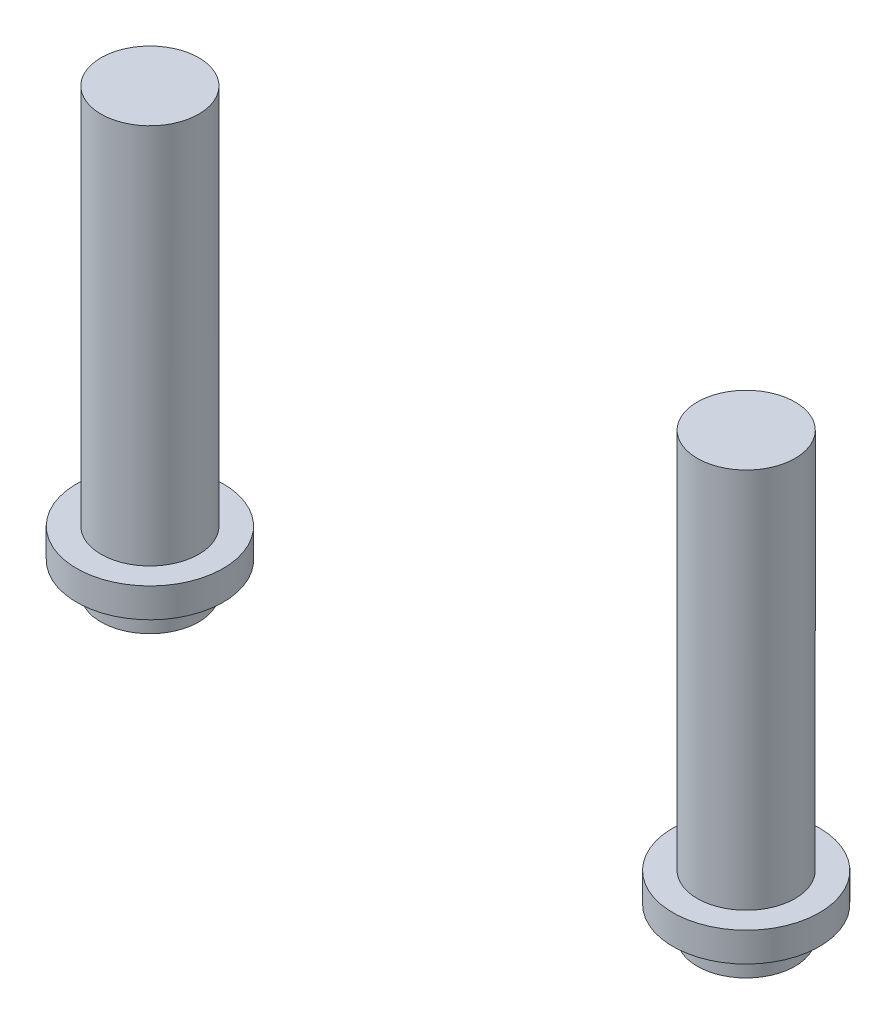
ISO-10303-21;
HEADER;
FILE_DESCRIPTION(('STEP AP214'),'2;1');
FILE_NAME('part.step','',(''),(''),'','','');
FILE_SCHEMA(('AUTOMOTIVE_DESIGN { 1 0 10303 214 1 1 1 1 }'));
ENDSEC;
DATA;
#1=APPLICATION_CONTEXT('core data for automotive mechanical design processes');
#2=APPLICATION_PROTOCOL_DEFINITION('international standard','automotive_design',2000,#1);
#3=PRODUCT_CONTEXT('',#1,'mechanical');
#4=PRODUCT('Part','Part','',(#3));
#5=PRODUCT_RELATED_PRODUCT_CATEGORY('part','',(#4));
#6=PRODUCT_DEFINITION_FORMATION('','',#4);
#7=PRODUCT_DEFINITION_CONTEXT('part definition',#1,'design');
#8=PRODUCT_DEFINITION('design','',#6,#7);
#9=PRODUCT_DEFINITION_SHAPE('','',#8);
#10=(LENGTH_UNIT() NAMED_UNIT(*) SI_UNIT(.MILLI.,.METRE.));
#11=(NAMED_UNIT(*) PLANE_ANGLE_UNIT() SI_UNIT($,.RADIAN.));
#12=(NAMED_UNIT(*) SI_UNIT($,.STERADIAN.) SOLID_ANGLE_UNIT());
#13=UNCERTAINTY_MEASURE_WITH_UNIT(LENGTH_MEASURE(1.E-05),#10,'distance_accuracy_value','');
#14=(GEOMETRIC_REPRESENTATION_CONTEXT(3) GLOBAL_UNCERTAINTY_ASSIGNED_CONTEXT((#13)) GLOBAL_UNIT_ASSIGNED_CONTEXT((#10,
#11,#12)) REPRESENTATION_CONTEXT('',''));
#15=CARTESIAN_POINT('',(0.,0.,0.));
#16=DIRECTION('',(0.,0.,1.));
#17=DIRECTION('',(1.,0.,0.));
#18=AXIS2_PLACEMENT_3D('',#15,#16,#17);
#19=CARTESIAN_POINT('',(19.5,0.,10.));
#20=DIRECTION('',(0.,1.,0.));
#21=DIRECTION('',(0.,0.,1.));
#22=AXIS2_PLACEMENT_3D('',#19,#20,#21);
#23=CYLINDRICAL_SURFACE('',#22,5.);
#24=CARTESIAN_POINT('',(19.5,6.,10.));
#25=DIRECTION('',(0.,-1.,0.));
#26=DIRECTION('',(0.,0.,-1.));
#27=AXIS2_PLACEMENT_3D('',#24,#25,#26);
#28=CIRCLE('',#27,5.);
#29=CARTESIAN_POINT('',(19.5,6.,5.));
#30=VERTEX_POINT('',#29);
#31=EDGE_CURVE('E65',#30,#30,#28,.T.);
#32=ORIENTED_EDGE('',*,*,#31,.F.);
#33=EDGE_LOOP('',(#32));
#34=FACE_BOUND('',#33,.T.);
#35=CARTESIAN_POINT('',(19.5,45.,9.99999999999999));
#36=DIRECTION('',(0.,1.,0.));
#37=DIRECTION('',(0.,0.,1.));
#38=AXIS2_PLACEMENT_3D('',#35,#36,#37);
#39=CIRCLE('',#38,5.);
#40=CARTESIAN_POINT('',(19.5,45.,15.));
#41=VERTEX_POINT('',#40);
#42=EDGE_CURVE('E69',#41,#41,#39,.T.);
#43=ORIENTED_EDGE('',*,*,#42,.F.);
#44=EDGE_LOOP('',(#43));
#45=FACE_BOUND('',#44,.T.);
#46=ADVANCED_FACE('F50',(#34,#45),#23,.T.);
#47=CARTESIAN_POINT('',(19.5,6.,10.));
#48=DIRECTION('',(0.,-1.,0.));
#49=DIRECTION('',(0.,0.,-1.));
#50=AXIS2_PLACEMENT_3D('',#47,#48,#49);
#51=CYLINDRICAL_SURFACE('',#50,7.5);
#52=CARTESIAN_POINT('',(19.5,6.,10.));
#53=DIRECTION('',(0.,-1.,0.));
#54=DIRECTION('',(0.,0.,-1.));
#55=AXIS2_PLACEMENT_3D('',#52,#53,#54);
#56=CIRCLE('',#55,7.5);
#57=CARTESIAN_POINT('',(19.5,6.,2.5));
#58=VERTEX_POINT('',#57);
#59=EDGE_CURVE('E67',#58,#58,#56,.T.);
#60=ORIENTED_EDGE('',*,*,#59,.T.);
#61=EDGE_LOOP('',(#60));
#62=FACE_BOUND('',#61,.T.);
#63=CARTESIAN_POINT('',(19.5,3.,10.));
#64=DIRECTION('',(0.,-1.,0.));
#65=DIRECTION('',(0.,0.,-1.));
#66=AXIS2_PLACEMENT_3D('',#63,#64,#65);
#67=CIRCLE('',#66,7.5);
#68=CARTESIAN_POINT('',(19.5,3.,2.5));
#69=VERTEX_POINT('',#68);
#70=EDGE_CURVE('E54',#69,#69,#67,.T.);
#71=ORIENTED_EDGE('',*,*,#70,.F.);
#72=EDGE_LOOP('',(#71));
#73=FACE_BOUND('',#72,.T.);
#74=ADVANCED_FACE('F52',(#62,#73),#51,.T.);
#75=CARTESIAN_POINT('',(19.5,6.,10.));
#76=DIRECTION('',(0.,-1.,0.));
#77=DIRECTION('',(0.,0.,-1.));
#78=AXIS2_PLACEMENT_3D('',#75,#76,#77);
#79=PLANE('',#78);
#80=ORIENTED_EDGE('',*,*,#31,.T.);
#81=EDGE_LOOP('',(#80));
#82=FACE_BOUND('',#81,.T.);
#83=ORIENTED_EDGE('',*,*,#59,.F.);
#84=EDGE_LOOP('',(#83));
#85=FACE_BOUND('',#84,.T.);
#86=ADVANCED_FACE('F85',(#82,#85),#79,.F.);
#87=CARTESIAN_POINT('',(19.5,3.,10.));
#88=DIRECTION('',(0.,-1.,0.));
#89=DIRECTION('',(0.,0.,-1.));
#90=AXIS2_PLACEMENT_3D('',#87,#88,#89);
#91=PLANE('',#90);
#92=CARTESIAN_POINT('',(19.5,3.,10.));
#93=DIRECTION('',(0.,-1.,0.));
#94=DIRECTION('',(0.,0.,-1.));
#95=AXIS2_PLACEMENT_3D('',#92,#93,#94);
#96=CIRCLE('',#95,5.);
#97=CARTESIAN_POINT('',(19.5,3.,5.));
#98=VERTEX_POINT('',#97);
#99=EDGE_CURVE('E11',#98,#98,#96,.T.);
#100=ORIENTED_EDGE('',*,*,#99,.F.);
#101=EDGE_LOOP('',(#100));
#102=FACE_BOUND('',#101,.T.);
#103=ORIENTED_EDGE('',*,*,#70,.T.);
#104=EDGE_LOOP('',(#103));
#105=FACE_BOUND('',#104,.T.);
#106=ADVANCED_FACE('F96',(#102,#105),#91,.T.);
#107=CARTESIAN_POINT('',(19.5,0.,10.));
#108=DIRECTION('',(0.,-1.,0.));
#109=DIRECTION('',(0.,0.,-1.));
#110=AXIS2_PLACEMENT_3D('',#107,#108,#109);
#111=PLANE('',#110);
#112=CARTESIAN_POINT('',(19.5,0.,10.));
#113=DIRECTION('',(0.,-1.,0.));
#114=DIRECTION('',(0.,0.,-1.));
#115=AXIS2_PLACEMENT_3D('',#112,#113,#114);
#116=CIRCLE('',#115,5.);
#117=CARTESIAN_POINT('',(19.5,0.,5.));
#118=VERTEX_POINT('',#117);
#119=EDGE_CURVE('E58',#118,#118,#116,.T.);
#120=ORIENTED_EDGE('',*,*,#119,.T.);
#121=EDGE_LOOP('',(#120));
#122=FACE_BOUND('',#121,.T.);
#123=ADVANCED_FACE('F90',(#122),#111,.T.);
#124=ORIENTED_EDGE('',*,*,#99,.T.);
#125=EDGE_LOOP('',(#124));
#126=FACE_BOUND('',#125,.T.);
#127=ORIENTED_EDGE('',*,*,#119,.F.);
#128=EDGE_LOOP('',(#127));
#129=FACE_BOUND('',#128,.T.);
#130=ADVANCED_FACE('F81',(#126,#129),#23,.T.);
#131=CARTESIAN_POINT('',(19.5,45.,9.99999999999999));
#132=DIRECTION('',(0.,1.,0.));
#133=DIRECTION('',(0.,0.,1.));
#134=AXIS2_PLACEMENT_3D('',#131,#132,#133);
#135=PLANE('',#134);
#136=ORIENTED_EDGE('',*,*,#42,.T.);
#137=EDGE_LOOP('',(#136));
#138=FACE_BOUND('',#137,.T.);
#139=ADVANCED_FACE('F76',(#138),#135,.T.);
#140=CLOSED_SHELL('',(#46,#74,#86,#106,#123,#130,#139));
#141=MANIFOLD_SOLID_BREP('B2',#140);
#142=CARTESIAN_POINT('',(80.4999999999999,0.,10.));
#143=DIRECTION('',(0.,-1.,0.));
#144=DIRECTION('',(0.,0.,-1.));
#145=AXIS2_PLACEMENT_3D('',#142,#143,#144);
#146=PLANE('',#145);
#147=CARTESIAN_POINT('',(80.4999999999999,0.,10.));
#148=DIRECTION('',(0.,-1.,0.));
#149=DIRECTION('',(0.,0.,-1.));
#150=AXIS2_PLACEMENT_3D('',#147,#148,#149);
#151=CIRCLE('',#150,5.);
#152=CARTESIAN_POINT('',(80.4999999999999,0.,4.99999999999999));
#153=VERTEX_POINT('',#152);
#154=EDGE_CURVE('E179',#153,#153,#151,.T.);
#155=ORIENTED_EDGE('',*,*,#154,.T.);
#156=EDGE_LOOP('',(#155));
#157=FACE_BOUND('',#156,.T.);
#158=ADVANCED_FACE('F172',(#157),#146,.T.);
#159=CARTESIAN_POINT('',(80.4999999999999,0.,10.));
#160=DIRECTION('',(0.,1.,0.));
#161=DIRECTION('',(0.,0.,1.));
#162=AXIS2_PLACEMENT_3D('',#159,#160,#161);
#163=CYLINDRICAL_SURFACE('',#162,5.);
#164=CARTESIAN_POINT('',(80.4999999999999,3.,10.));
#165=DIRECTION('',(0.,-1.,0.));
#166=DIRECTION('',(0.,0.,-1.));
#167=AXIS2_PLACEMENT_3D('',#164,#165,#166);
#168=CIRCLE('',#167,5.);
#169=CARTESIAN_POINT('',(80.4999999999999,3.,4.99999999999999));
#170=VERTEX_POINT('',#169);
#171=EDGE_CURVE('E183',#170,#170,#168,.T.);
#172=ORIENTED_EDGE('',*,*,#171,.T.);
#173=EDGE_LOOP('',(#172));
#174=FACE_BOUND('',#173,.T.);
#175=ORIENTED_EDGE('',*,*,#154,.F.);
#176=EDGE_LOOP('',(#175));
#177=FACE_BOUND('',#176,.T.);
#178=ADVANCED_FACE('F174',(#174,#177),#163,.T.);
#179=CARTESIAN_POINT('',(80.4999999999999,3.,10.));
#180=DIRECTION('',(0.,-1.,0.));
#181=DIRECTION('',(0.,0.,-1.));
#182=AXIS2_PLACEMENT_3D('',#179,#180,#181);
#183=PLANE('',#182);
#184=ORIENTED_EDGE('',*,*,#171,.F.);
#185=EDGE_LOOP('',(#184));
#186=FACE_BOUND('',#185,.T.);
#187=CARTESIAN_POINT('',(80.4999999999999,3.,10.));
#188=DIRECTION('',(0.,-1.,0.));
#189=DIRECTION('',(0.,0.,-1.));
#190=AXIS2_PLACEMENT_3D('',#187,#188,#189);
#191=CIRCLE('',#190,7.50000000000001);
#192=CARTESIAN_POINT('',(80.4999999999999,3.,2.49999999999999));
#193=VERTEX_POINT('',#192);
#194=EDGE_CURVE('E190',#193,#193,#191,.T.);
#195=ORIENTED_EDGE('',*,*,#194,.T.);
#196=EDGE_LOOP('',(#195));
#197=FACE_BOUND('',#196,.T.);
#198=ADVANCED_FACE('F213',(#186,#197),#183,.T.);
#199=CARTESIAN_POINT('',(80.4999999999999,6.,10.));
#200=DIRECTION('',(0.,-1.,0.));
#201=DIRECTION('',(0.,0.,-1.));
#202=AXIS2_PLACEMENT_3D('',#199,#200,#201);
#203=CYLINDRICAL_SURFACE('',#202,7.50000000000001);
#204=CARTESIAN_POINT('',(80.4999999999999,6.,10.));
#205=DIRECTION('',(0.,-1.,0.));
#206=DIRECTION('',(0.,0.,-1.));
#207=AXIS2_PLACEMENT_3D('',#204,#205,#206);
#208=CIRCLE('',#207,7.50000000000001);
#209=CARTESIAN_POINT('',(80.4999999999999,6.,2.49999999999999));
#210=VERTEX_POINT('',#209);
#211=EDGE_CURVE('E188',#210,#210,#208,.T.);
#212=ORIENTED_EDGE('',*,*,#211,.T.);
#213=EDGE_LOOP('',(#212));
#214=FACE_BOUND('',#213,.T.);
#215=ORIENTED_EDGE('',*,*,#194,.F.);
#216=EDGE_LOOP('',(#215));
#217=FACE_BOUND('',#216,.T.);
#218=ADVANCED_FACE('F210',(#214,#217),#203,.T.);
#219=CARTESIAN_POINT('',(80.4999999999999,6.,10.));
#220=DIRECTION('',(0.,-1.,0.));
#221=DIRECTION('',(0.,0.,-1.));
#222=AXIS2_PLACEMENT_3D('',#219,#220,#221);
#223=PLANE('',#222);
#224=CARTESIAN_POINT('',(80.4999999999999,6.,10.));
#225=DIRECTION('',(0.,-1.,0.));
#226=DIRECTION('',(0.,0.,-1.));
#227=AXIS2_PLACEMENT_3D('',#224,#225,#226);
#228=CIRCLE('',#227,5.);
#229=CARTESIAN_POINT('',(80.4999999999999,6.,4.99999999999999));
#230=VERTEX_POINT('',#229);
#231=EDGE_CURVE('E49',#230,#230,#228,.T.);
#232=ORIENTED_EDGE('',*,*,#231,.T.);
#233=EDGE_LOOP('',(#232));
#234=FACE_BOUND('',#233,.T.);
#235=ORIENTED_EDGE('',*,*,#211,.F.);
#236=EDGE_LOOP('',(#235));
#237=FACE_BOUND('',#236,.T.);
#238=ADVANCED_FACE('F203',(#234,#237),#223,.F.);
#239=ORIENTED_EDGE('',*,*,#231,.F.);
#240=EDGE_LOOP('',(#239));
#241=FACE_BOUND('',#240,.T.);
#242=CARTESIAN_POINT('',(80.4999999999999,45.,10.));
#243=DIRECTION('',(0.,1.,0.));
#244=DIRECTION('',(0.,0.,1.));
#245=AXIS2_PLACEMENT_3D('',#242,#243,#244);
#246=CIRCLE('',#245,5.);
#247=CARTESIAN_POINT('',(80.4999999999999,45.,15.));
#248=VERTEX_POINT('',#247);
#249=EDGE_CURVE('E193',#248,#248,#246,.T.);
#250=ORIENTED_EDGE('',*,*,#249,.F.);
#251=EDGE_LOOP('',(#250));
#252=FACE_BOUND('',#251,.T.);
#253=ADVANCED_FACE('F201',(#241,#252),#163,.T.);
#254=CARTESIAN_POINT('',(80.4999999999999,45.,10.));
#255=DIRECTION('',(0.,1.,0.));
#256=DIRECTION('',(0.,0.,1.));
#257=AXIS2_PLACEMENT_3D('',#254,#255,#256);
#258=PLANE('',#257);
#259=ORIENTED_EDGE('',*,*,#249,.T.);
#260=EDGE_LOOP('',(#259));
#261=FACE_BOUND('',#260,.T.);
#262=ADVANCED_FACE('F199',(#261),#258,.T.);
#263=CLOSED_SHELL('',(#158,#178,#198,#218,#238,#253,#262));
#264=MANIFOLD_SOLID_BREP('B6',#263);
#265=ADVANCED_BREP_SHAPE_REPRESENTATION('',(#18,#141,#264),#14);
#266=SHAPE_DEFINITION_REPRESENTATION(#9,#265);
ENDSEC;
END-ISO-10303-21;
